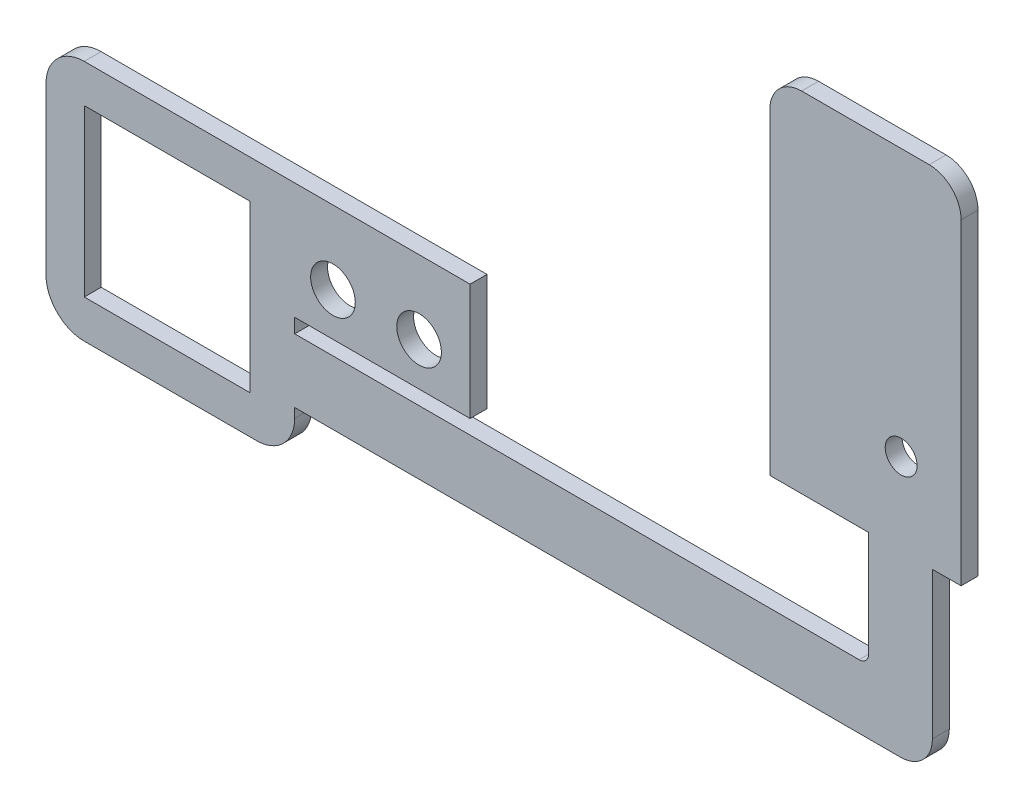
ISO-10303-21;
HEADER;
FILE_DESCRIPTION(('STEP AP214'),'2;1');
FILE_NAME('part.step','',(''),(''),'','','');
FILE_SCHEMA(('AUTOMOTIVE_DESIGN { 1 0 10303 214 1 1 1 1 }'));
ENDSEC;
DATA;
#1=APPLICATION_CONTEXT('core data for automotive mechanical design processes');
#2=APPLICATION_PROTOCOL_DEFINITION('international standard','automotive_design',2000,#1);
#3=PRODUCT_CONTEXT('',#1,'mechanical');
#4=PRODUCT('Part','Part','',(#3));
#5=PRODUCT_RELATED_PRODUCT_CATEGORY('part','',(#4));
#6=PRODUCT_DEFINITION_FORMATION('','',#4);
#7=PRODUCT_DEFINITION_CONTEXT('part definition',#1,'design');
#8=PRODUCT_DEFINITION('design','',#6,#7);
#9=PRODUCT_DEFINITION_SHAPE('','',#8);
#10=(LENGTH_UNIT() NAMED_UNIT(*) SI_UNIT(.MILLI.,.METRE.));
#11=(NAMED_UNIT(*) PLANE_ANGLE_UNIT() SI_UNIT($,.RADIAN.));
#12=(NAMED_UNIT(*) SI_UNIT($,.STERADIAN.) SOLID_ANGLE_UNIT());
#13=UNCERTAINTY_MEASURE_WITH_UNIT(LENGTH_MEASURE(1.E-05),#10,'distance_accuracy_value','');
#14=(GEOMETRIC_REPRESENTATION_CONTEXT(3) GLOBAL_UNCERTAINTY_ASSIGNED_CONTEXT((#13)) GLOBAL_UNIT_ASSIGNED_CONTEXT((#10,
#11,#12)) REPRESENTATION_CONTEXT('',''));
#15=CARTESIAN_POINT('',(0.,0.,0.));
#16=DIRECTION('',(0.,0.,1.));
#17=DIRECTION('',(1.,0.,0.));
#18=AXIS2_PLACEMENT_3D('',#15,#16,#17);
#19=CARTESIAN_POINT('',(123.02,-64.125,0.));
#20=DIRECTION('',(0.,0.,-1.));
#21=DIRECTION('',(1.,0.,0.));
#22=AXIS2_PLACEMENT_3D('',#19,#20,#21);
#23=CYLINDRICAL_SURFACE('',#22,0.5);
#24=DIRECTION('',(0.,0.,1.));
#25=VECTOR('',#24,1.);
#26=CARTESIAN_POINT('',(123.52,-64.125,0.));
#27=LINE('',#26,#25);
#28=CARTESIAN_POINT('',(123.52,-64.125,0.));
#29=VERTEX_POINT('',#28);
#30=CARTESIAN_POINT('',(123.52,-64.125,0.53));
#31=VERTEX_POINT('',#30);
#32=EDGE_CURVE('E10',#29,#31,#27,.T.);
#33=ORIENTED_EDGE('',*,*,#32,.T.);
#34=CARTESIAN_POINT('',(123.02,-64.125,0.53));
#35=DIRECTION('',(0.,0.,1.));
#36=DIRECTION('',(1.,0.,0.));
#37=AXIS2_PLACEMENT_3D('',#34,#35,#36);
#38=CIRCLE('',#37,0.5);
#39=EDGE_CURVE('E411',#31,#31,#38,.T.);
#40=ORIENTED_EDGE('',*,*,#39,.T.);
#41=ORIENTED_EDGE('',*,*,#32,.F.);
#42=CARTESIAN_POINT('',(123.02,-64.125,0.));
#43=DIRECTION('',(0.,0.,1.));
#44=DIRECTION('',(1.,0.,0.));
#45=AXIS2_PLACEMENT_3D('',#42,#43,#44);
#46=CIRCLE('',#45,0.5);
#47=EDGE_CURVE('E323',#29,#29,#46,.T.);
#48=ORIENTED_EDGE('',*,*,#47,.F.);
#49=EDGE_LOOP('',(#33,#40,#41,#48));
#50=FACE_BOUND('',#49,.T.);
#51=ADVANCED_FACE('F15',(#50),#23,.F.);
#52=CARTESIAN_POINT('',(107.9,-68.5,-0.046));
#53=DIRECTION('',(0.,0.,-1.));
#54=DIRECTION('',(0.,-1.,0.));
#55=AXIS2_PLACEMENT_3D('',#52,#53,#54);
#56=CYLINDRICAL_SURFACE('',#55,0.7);
#57=CARTESIAN_POINT('',(107.9,-68.5,0.));
#58=DIRECTION('',(0.,0.,-1.));
#59=DIRECTION('',(0.,-1.,0.));
#60=AXIS2_PLACEMENT_3D('',#57,#58,#59);
#61=CIRCLE('',#60,0.7);
#62=CARTESIAN_POINT('',(107.9,-69.2,0.));
#63=VERTEX_POINT('',#62);
#64=EDGE_CURVE('E351',#63,#63,#61,.T.);
#65=ORIENTED_EDGE('',*,*,#64,.T.);
#66=DIRECTION('',(0.,0.,1.));
#67=VECTOR('',#66,1.);
#68=CARTESIAN_POINT('',(107.9,-69.2,-0.046));
#69=LINE('',#68,#67);
#70=CARTESIAN_POINT('',(107.9,-69.2,0.53));
#71=VERTEX_POINT('',#70);
#72=EDGE_CURVE('E26',#63,#71,#69,.T.);
#73=ORIENTED_EDGE('',*,*,#72,.T.);
#74=CARTESIAN_POINT('',(107.9,-68.5,0.53));
#75=DIRECTION('',(0.,0.,-1.));
#76=DIRECTION('',(0.,-1.,0.));
#77=AXIS2_PLACEMENT_3D('',#74,#75,#76);
#78=CIRCLE('',#77,0.7);
#79=EDGE_CURVE('E415',#71,#71,#78,.T.);
#80=ORIENTED_EDGE('',*,*,#79,.F.);
#81=ORIENTED_EDGE('',*,*,#72,.F.);
#82=EDGE_LOOP('',(#65,#73,#80,#81));
#83=FACE_BOUND('',#82,.T.);
#84=ADVANCED_FACE('F920',(#83),#56,.F.);
#85=CARTESIAN_POINT('',(105.2,-68.5,-0.046));
#86=DIRECTION('',(0.,0.,-1.));
#87=DIRECTION('',(0.,-1.,0.));
#88=AXIS2_PLACEMENT_3D('',#85,#86,#87);
#89=CYLINDRICAL_SURFACE('',#88,0.7);
#90=CARTESIAN_POINT('',(105.2,-68.5,0.));
#91=DIRECTION('',(0.,0.,-1.));
#92=DIRECTION('',(0.,-1.,0.));
#93=AXIS2_PLACEMENT_3D('',#90,#91,#92);
#94=CIRCLE('',#93,0.7);
#95=CARTESIAN_POINT('',(105.2,-69.2,0.));
#96=VERTEX_POINT('',#95);
#97=EDGE_CURVE('E469',#96,#96,#94,.T.);
#98=ORIENTED_EDGE('',*,*,#97,.T.);
#99=DIRECTION('',(0.,0.,1.));
#100=VECTOR('',#99,1.);
#101=CARTESIAN_POINT('',(105.2,-69.2,-0.046));
#102=LINE('',#101,#100);
#103=CARTESIAN_POINT('',(105.2,-69.2,0.53));
#104=VERTEX_POINT('',#103);
#105=EDGE_CURVE('E263',#96,#104,#102,.T.);
#106=ORIENTED_EDGE('',*,*,#105,.T.);
#107=CARTESIAN_POINT('',(105.2,-68.5,0.53));
#108=DIRECTION('',(0.,0.,-1.));
#109=DIRECTION('',(0.,-1.,0.));
#110=AXIS2_PLACEMENT_3D('',#107,#108,#109);
#111=CIRCLE('',#110,0.7);
#112=EDGE_CURVE('E274',#104,#104,#111,.T.);
#113=ORIENTED_EDGE('',*,*,#112,.F.);
#114=ORIENTED_EDGE('',*,*,#105,.F.);
#115=EDGE_LOOP('',(#98,#106,#113,#114));
#116=FACE_BOUND('',#115,.T.);
#117=ADVANCED_FACE('F880',(#116),#89,.F.);
#118=CARTESIAN_POINT('',(102.6,-67.4,0.));
#119=DIRECTION('',(0.,-1.,0.));
#120=DIRECTION('',(0.,0.,-1.));
#121=AXIS2_PLACEMENT_3D('',#118,#119,#120);
#122=PLANE('',#121);
#123=DIRECTION('',(0.,0.,1.));
#124=VECTOR('',#123,1.);
#125=CARTESIAN_POINT('',(102.6,-67.4,0.));
#126=LINE('',#125,#124);
#127=CARTESIAN_POINT('',(102.6,-67.4,0.));
#128=VERTEX_POINT('',#127);
#129=CARTESIAN_POINT('',(102.6,-67.4,0.53));
#130=VERTEX_POINT('',#129);
#131=EDGE_CURVE('E251',#128,#130,#126,.T.);
#132=ORIENTED_EDGE('',*,*,#131,.T.);
#133=DIRECTION('',(-1.,0.,0.));
#134=VECTOR('',#133,1.);
#135=CARTESIAN_POINT('',(102.6,-67.4,0.53));
#136=LINE('',#135,#134);
#137=CARTESIAN_POINT('',(97.4,-67.4,0.53));
#138=VERTEX_POINT('',#137);
#139=EDGE_CURVE('E255',#130,#138,#136,.T.);
#140=ORIENTED_EDGE('',*,*,#139,.T.);
#141=DIRECTION('',(0.,0.,1.));
#142=VECTOR('',#141,1.);
#143=CARTESIAN_POINT('',(97.4,-67.4,0.));
#144=LINE('',#143,#142);
#145=CARTESIAN_POINT('',(97.4,-67.4,0.));
#146=VERTEX_POINT('',#145);
#147=EDGE_CURVE('E264',#146,#138,#144,.T.);
#148=ORIENTED_EDGE('',*,*,#147,.F.);
#149=DIRECTION('',(-1.,0.,0.));
#150=VECTOR('',#149,1.);
#151=CARTESIAN_POINT('',(102.6,-67.4,0.));
#152=LINE('',#151,#150);
#153=EDGE_CURVE('E258',#128,#146,#152,.T.);
#154=ORIENTED_EDGE('',*,*,#153,.F.);
#155=EDGE_LOOP('',(#132,#140,#148,#154));
#156=FACE_BOUND('',#155,.T.);
#157=ADVANCED_FACE('F253',(#156),#122,.T.);
#158=CARTESIAN_POINT('',(102.6,-72.6,0.));
#159=DIRECTION('',(-1.,0.,0.));
#160=DIRECTION('',(0.,0.,1.));
#161=AXIS2_PLACEMENT_3D('',#158,#159,#160);
#162=PLANE('',#161);
#163=DIRECTION('',(0.,0.,1.));
#164=VECTOR('',#163,1.);
#165=CARTESIAN_POINT('',(102.6,-72.6,0.));
#166=LINE('',#165,#164);
#167=CARTESIAN_POINT('',(102.6,-72.6,0.));
#168=VERTEX_POINT('',#167);
#169=CARTESIAN_POINT('',(102.6,-72.6,0.53));
#170=VERTEX_POINT('',#169);
#171=EDGE_CURVE('E269',#168,#170,#166,.T.);
#172=ORIENTED_EDGE('',*,*,#171,.T.);
#173=DIRECTION('',(0.,1.,0.));
#174=VECTOR('',#173,1.);
#175=CARTESIAN_POINT('',(102.6,-72.6,0.53));
#176=LINE('',#175,#174);
#177=EDGE_CURVE('E267',#170,#130,#176,.T.);
#178=ORIENTED_EDGE('',*,*,#177,.T.);
#179=ORIENTED_EDGE('',*,*,#131,.F.);
#180=DIRECTION('',(0.,1.,0.));
#181=VECTOR('',#180,1.);
#182=CARTESIAN_POINT('',(102.6,-72.6,0.));
#183=LINE('',#182,#181);
#184=EDGE_CURVE('E431',#168,#128,#183,.T.);
#185=ORIENTED_EDGE('',*,*,#184,.F.);
#186=EDGE_LOOP('',(#172,#178,#179,#185));
#187=FACE_BOUND('',#186,.T.);
#188=ADVANCED_FACE('F268',(#187),#162,.T.);
#189=CARTESIAN_POINT('',(97.4,-67.4,0.));
#190=DIRECTION('',(1.,0.,0.));
#191=DIRECTION('',(0.,1.,0.));
#192=AXIS2_PLACEMENT_3D('',#189,#190,#191);
#193=PLANE('',#192);
#194=ORIENTED_EDGE('',*,*,#147,.T.);
#195=DIRECTION('',(0.,-1.,0.));
#196=VECTOR('',#195,1.);
#197=CARTESIAN_POINT('',(97.4,-67.4,0.53));
#198=LINE('',#197,#196);
#199=CARTESIAN_POINT('',(97.4,-72.6,0.53));
#200=VERTEX_POINT('',#199);
#201=EDGE_CURVE('E279',#138,#200,#198,.T.);
#202=ORIENTED_EDGE('',*,*,#201,.T.);
#203=DIRECTION('',(0.,0.,1.));
#204=VECTOR('',#203,1.);
#205=CARTESIAN_POINT('',(97.4,-72.6,0.));
#206=LINE('',#205,#204);
#207=CARTESIAN_POINT('',(97.4,-72.6,0.));
#208=VERTEX_POINT('',#207);
#209=EDGE_CURVE('E312',#208,#200,#206,.T.);
#210=ORIENTED_EDGE('',*,*,#209,.F.);
#211=DIRECTION('',(0.,-1.,0.));
#212=VECTOR('',#211,1.);
#213=CARTESIAN_POINT('',(97.4,-67.4,0.));
#214=LINE('',#213,#212);
#215=EDGE_CURVE('E389',#146,#208,#214,.T.);
#216=ORIENTED_EDGE('',*,*,#215,.F.);
#217=EDGE_LOOP('',(#194,#202,#210,#216));
#218=FACE_BOUND('',#217,.T.);
#219=ADVANCED_FACE('F614',(#218),#193,.T.);
#220=CARTESIAN_POINT('',(97.4,-72.6,0.));
#221=DIRECTION('',(0.,1.,0.));
#222=DIRECTION('',(1.,0.,0.));
#223=AXIS2_PLACEMENT_3D('',#220,#221,#222);
#224=PLANE('',#223);
#225=ORIENTED_EDGE('',*,*,#209,.T.);
#226=DIRECTION('',(1.,0.,0.));
#227=VECTOR('',#226,1.);
#228=CARTESIAN_POINT('',(97.4,-72.6,0.53));
#229=LINE('',#228,#227);
#230=EDGE_CURVE('E286',#200,#170,#229,.T.);
#231=ORIENTED_EDGE('',*,*,#230,.T.);
#232=ORIENTED_EDGE('',*,*,#171,.F.);
#233=DIRECTION('',(1.,0.,0.));
#234=VECTOR('',#233,1.);
#235=CARTESIAN_POINT('',(97.4,-72.6,0.));
#236=LINE('',#235,#234);
#237=EDGE_CURVE('E393',#208,#168,#236,.T.);
#238=ORIENTED_EDGE('',*,*,#237,.F.);
#239=EDGE_LOOP('',(#225,#231,#232,#238));
#240=FACE_BOUND('',#239,.T.);
#241=ADVANCED_FACE('F611',(#240),#224,.T.);
#242=CARTESIAN_POINT('',(97.400000469195,-67.40000046919,0.));
#243=DIRECTION('',(0.,0.,-1.));
#244=DIRECTION('',(-0.999999999999924,3.9099537344877E-07,0.));
#245=AXIS2_PLACEMENT_3D('',#242,#243,#244);
#246=CYLINDRICAL_SURFACE('',#245,1.200000469195);
#247=DIRECTION('',(0.,0.,1.));
#248=VECTOR('',#247,1.);
#249=CARTESIAN_POINT('',(96.2,-67.4,0.));
#250=LINE('',#249,#248);
#251=CARTESIAN_POINT('',(96.2,-67.4,0.));
#252=VERTEX_POINT('',#251);
#253=CARTESIAN_POINT('',(96.2,-67.4,0.53));
#254=VERTEX_POINT('',#253);
#255=EDGE_CURVE('E396',#252,#254,#250,.T.);
#256=ORIENTED_EDGE('',*,*,#255,.T.);
#257=CARTESIAN_POINT('',(97.400000469195,-67.40000046919,0.53));
#258=DIRECTION('',(0.,0.,-1.));
#259=DIRECTION('',(-0.999999999999924,3.9099537344877E-07,0.));
#260=AXIS2_PLACEMENT_3D('',#257,#258,#259);
#261=CIRCLE('',#260,1.200000469195);
#262=CARTESIAN_POINT('',(97.4,-66.2,0.53));
#263=VERTEX_POINT('',#262);
#264=EDGE_CURVE('E368',#254,#263,#261,.T.);
#265=ORIENTED_EDGE('',*,*,#264,.T.);
#266=DIRECTION('',(0.,0.,1.));
#267=VECTOR('',#266,1.);
#268=CARTESIAN_POINT('',(97.4,-66.2,0.));
#269=LINE('',#268,#267);
#270=CARTESIAN_POINT('',(97.4,-66.2,0.));
#271=VERTEX_POINT('',#270);
#272=EDGE_CURVE('E394',#271,#263,#269,.T.);
#273=ORIENTED_EDGE('',*,*,#272,.F.);
#274=CARTESIAN_POINT('',(97.400000469195,-67.40000046919,0.));
#275=DIRECTION('',(0.,0.,-1.));
#276=DIRECTION('',(-0.999999999999924,3.9099537344877E-07,0.));
#277=AXIS2_PLACEMENT_3D('',#274,#275,#276);
#278=CIRCLE('',#277,1.200000469195);
#279=EDGE_CURVE('E298',#252,#271,#278,.T.);
#280=ORIENTED_EDGE('',*,*,#279,.F.);
#281=EDGE_LOOP('',(#256,#265,#273,#280));
#282=FACE_BOUND('',#281,.T.);
#283=ADVANCED_FACE('F994',(#282),#246,.T.);
#284=CARTESIAN_POINT('',(97.4,-66.2,0.));
#285=DIRECTION('',(0.,1.,0.));
#286=DIRECTION('',(1.,0.,0.));
#287=AXIS2_PLACEMENT_3D('',#284,#285,#286);
#288=PLANE('',#287);
#289=ORIENTED_EDGE('',*,*,#272,.T.);
#290=DIRECTION('',(1.,0.,0.));
#291=VECTOR('',#290,1.);
#292=CARTESIAN_POINT('',(97.4,-66.2,0.53));
#293=LINE('',#292,#291);
#294=CARTESIAN_POINT('',(109.5,-66.2,0.53));
#295=VERTEX_POINT('',#294);
#296=EDGE_CURVE('E364',#263,#295,#293,.T.);
#297=ORIENTED_EDGE('',*,*,#296,.T.);
#298=DIRECTION('',(0.,0.,1.));
#299=VECTOR('',#298,1.);
#300=CARTESIAN_POINT('',(109.5,-66.2,0.));
#301=LINE('',#300,#299);
#302=CARTESIAN_POINT('',(109.5,-66.2,0.));
#303=VERTEX_POINT('',#302);
#304=EDGE_CURVE('E454',#303,#295,#301,.T.);
#305=ORIENTED_EDGE('',*,*,#304,.F.);
#306=DIRECTION('',(1.,0.,0.));
#307=VECTOR('',#306,1.);
#308=CARTESIAN_POINT('',(97.4,-66.2,0.));
#309=LINE('',#308,#307);
#310=EDGE_CURVE('E302',#271,#303,#309,.T.);
#311=ORIENTED_EDGE('',*,*,#310,.F.);
#312=EDGE_LOOP('',(#289,#297,#305,#311));
#313=FACE_BOUND('',#312,.T.);
#314=ADVANCED_FACE('F1006',(#313),#288,.T.);
#315=CARTESIAN_POINT('',(96.2,-72.6,0.));
#316=DIRECTION('',(-1.,0.,0.));
#317=DIRECTION('',(0.,0.,1.));
#318=AXIS2_PLACEMENT_3D('',#315,#316,#317);
#319=PLANE('',#318);
#320=DIRECTION('',(0.,0.,1.));
#321=VECTOR('',#320,1.);
#322=CARTESIAN_POINT('',(96.2,-72.6,0.));
#323=LINE('',#322,#321);
#324=CARTESIAN_POINT('',(96.2,-72.6,0.));
#325=VERTEX_POINT('',#324);
#326=CARTESIAN_POINT('',(96.2,-72.6,0.53));
#327=VERTEX_POINT('',#326);
#328=EDGE_CURVE('E474',#325,#327,#323,.T.);
#329=ORIENTED_EDGE('',*,*,#328,.T.);
#330=DIRECTION('',(0.,1.,0.));
#331=VECTOR('',#330,1.);
#332=CARTESIAN_POINT('',(96.2,-72.6,0.53));
#333=LINE('',#332,#331);
#334=EDGE_CURVE('E358',#327,#254,#333,.T.);
#335=ORIENTED_EDGE('',*,*,#334,.T.);
#336=ORIENTED_EDGE('',*,*,#255,.F.);
#337=DIRECTION('',(0.,1.,0.));
#338=VECTOR('',#337,1.);
#339=CARTESIAN_POINT('',(96.2,-72.6,0.));
#340=LINE('',#339,#338);
#341=EDGE_CURVE('E303',#325,#252,#340,.T.);
#342=ORIENTED_EDGE('',*,*,#341,.F.);
#343=EDGE_LOOP('',(#329,#335,#336,#342));
#344=FACE_BOUND('',#343,.T.);
#345=ADVANCED_FACE('F939',(#344),#319,.T.);
#346=CARTESIAN_POINT('',(109.5,-66.2,0.));
#347=DIRECTION('',(1.,0.,0.));
#348=DIRECTION('',(0.,1.,0.));
#349=AXIS2_PLACEMENT_3D('',#346,#347,#348);
#350=PLANE('',#349);
#351=ORIENTED_EDGE('',*,*,#304,.T.);
#352=DIRECTION('',(0.,-1.,0.));
#353=VECTOR('',#352,1.);
#354=CARTESIAN_POINT('',(109.5,-66.2,0.53));
#355=LINE('',#354,#353);
#356=CARTESIAN_POINT('',(109.5,-69.85,0.53));
#357=VERTEX_POINT('',#356);
#358=EDGE_CURVE('E369',#295,#357,#355,.T.);
#359=ORIENTED_EDGE('',*,*,#358,.T.);
#360=DIRECTION('',(0.,0.,1.));
#361=VECTOR('',#360,1.);
#362=CARTESIAN_POINT('',(109.5,-69.85,0.));
#363=LINE('',#362,#361);
#364=CARTESIAN_POINT('',(109.5,-69.85,0.));
#365=VERTEX_POINT('',#364);
#366=EDGE_CURVE('E465',#365,#357,#363,.T.);
#367=ORIENTED_EDGE('',*,*,#366,.F.);
#368=DIRECTION('',(0.,-1.,0.));
#369=VECTOR('',#368,1.);
#370=CARTESIAN_POINT('',(109.5,-66.2,0.));
#371=LINE('',#370,#369);
#372=EDGE_CURVE('E297',#303,#365,#371,.T.);
#373=ORIENTED_EDGE('',*,*,#372,.F.);
#374=EDGE_LOOP('',(#351,#359,#367,#373));
#375=FACE_BOUND('',#374,.T.);
#376=ADVANCED_FACE('F933',(#375),#350,.T.);
#377=CARTESIAN_POINT('',(97.400000469195,-72.5999995308,0.));
#378=DIRECTION('',(0.,0.,-1.));
#379=DIRECTION('',(-3.9099537344877E-07,-0.999999999999924,0.));
#380=AXIS2_PLACEMENT_3D('',#377,#378,#379);
#381=CYLINDRICAL_SURFACE('',#380,1.200000469195);
#382=DIRECTION('',(0.,0.,1.));
#383=VECTOR('',#382,1.);
#384=CARTESIAN_POINT('',(97.4,-73.8,0.));
#385=LINE('',#384,#383);
#386=CARTESIAN_POINT('',(97.4,-73.8,0.));
#387=VERTEX_POINT('',#386);
#388=CARTESIAN_POINT('',(97.4,-73.8,0.53));
#389=VERTEX_POINT('',#388);
#390=EDGE_CURVE('E462',#387,#389,#385,.T.);
#391=ORIENTED_EDGE('',*,*,#390,.T.);
#392=CARTESIAN_POINT('',(97.400000469195,-72.5999995308,0.53));
#393=DIRECTION('',(0.,0.,-1.));
#394=DIRECTION('',(-3.9099537344877E-07,-0.999999999999924,0.));
#395=AXIS2_PLACEMENT_3D('',#392,#393,#394);
#396=CIRCLE('',#395,1.200000469195);
#397=EDGE_CURVE('E353',#389,#327,#396,.T.);
#398=ORIENTED_EDGE('',*,*,#397,.T.);
#399=ORIENTED_EDGE('',*,*,#328,.F.);
#400=CARTESIAN_POINT('',(97.400000469195,-72.5999995308,0.));
#401=DIRECTION('',(0.,0.,-1.));
#402=DIRECTION('',(-3.9099537344877E-07,-0.999999999999924,0.));
#403=AXIS2_PLACEMENT_3D('',#400,#401,#402);
#404=CIRCLE('',#403,1.200000469195);
#405=EDGE_CURVE('E603',#387,#325,#404,.T.);
#406=ORIENTED_EDGE('',*,*,#405,.F.);
#407=EDGE_LOOP('',(#391,#398,#399,#406));
#408=FACE_BOUND('',#407,.T.);
#409=ADVANCED_FACE('F938',(#408),#381,.T.);
#410=CARTESIAN_POINT('',(109.5,-69.85,0.));
#411=DIRECTION('',(0.,-1.,0.));
#412=DIRECTION('',(0.,0.,-1.));
#413=AXIS2_PLACEMENT_3D('',#410,#411,#412);
#414=PLANE('',#413);
#415=ORIENTED_EDGE('',*,*,#366,.T.);
#416=DIRECTION('',(-1.,0.,0.));
#417=VECTOR('',#416,1.);
#418=CARTESIAN_POINT('',(109.5,-69.85,0.53));
#419=LINE('',#418,#417);
#420=CARTESIAN_POINT('',(104.,-69.85,0.53));
#421=VERTEX_POINT('',#420);
#422=EDGE_CURVE('E407',#357,#421,#419,.T.);
#423=ORIENTED_EDGE('',*,*,#422,.T.);
#424=DIRECTION('',(0.,0.,1.));
#425=VECTOR('',#424,1.);
#426=CARTESIAN_POINT('',(104.,-69.85,0.));
#427=LINE('',#426,#425);
#428=CARTESIAN_POINT('',(104.,-69.85,0.));
#429=VERTEX_POINT('',#428);
#430=EDGE_CURVE('E451',#429,#421,#427,.T.);
#431=ORIENTED_EDGE('',*,*,#430,.F.);
#432=DIRECTION('',(-1.,0.,0.));
#433=VECTOR('',#432,1.);
#434=CARTESIAN_POINT('',(109.5,-69.85,0.));
#435=LINE('',#434,#433);
#436=EDGE_CURVE('E292',#365,#429,#435,.T.);
#437=ORIENTED_EDGE('',*,*,#436,.F.);
#438=EDGE_LOOP('',(#415,#423,#431,#437));
#439=FACE_BOUND('',#438,.T.);
#440=ADVANCED_FACE('F17',(#439),#414,.T.);
#441=CARTESIAN_POINT('',(102.8,-73.8,0.));
#442=DIRECTION('',(0.,-1.,0.));
#443=DIRECTION('',(0.,0.,-1.));
#444=AXIS2_PLACEMENT_3D('',#441,#442,#443);
#445=PLANE('',#444);
#446=DIRECTION('',(0.,0.,1.));
#447=VECTOR('',#446,1.);
#448=CARTESIAN_POINT('',(102.8,-73.8,0.));
#449=LINE('',#448,#447);
#450=CARTESIAN_POINT('',(102.8,-73.8,0.));
#451=VERTEX_POINT('',#450);
#452=CARTESIAN_POINT('',(102.8,-73.8,0.53));
#453=VERTEX_POINT('',#452);
#454=EDGE_CURVE('E448',#451,#453,#449,.T.);
#455=ORIENTED_EDGE('',*,*,#454,.T.);
#456=DIRECTION('',(-1.,0.,0.));
#457=VECTOR('',#456,1.);
#458=CARTESIAN_POINT('',(102.8,-73.8,0.53));
#459=LINE('',#458,#457);
#460=EDGE_CURVE('E357',#453,#389,#459,.T.);
#461=ORIENTED_EDGE('',*,*,#460,.T.);
#462=ORIENTED_EDGE('',*,*,#390,.F.);
#463=DIRECTION('',(-1.,0.,0.));
#464=VECTOR('',#463,1.);
#465=CARTESIAN_POINT('',(102.8,-73.8,0.));
#466=LINE('',#465,#464);
#467=EDGE_CURVE('E401',#451,#387,#466,.T.);
#468=ORIENTED_EDGE('',*,*,#467,.F.);
#469=EDGE_LOOP('',(#455,#461,#462,#468));
#470=FACE_BOUND('',#469,.T.);
#471=ADVANCED_FACE('F891',(#470),#445,.T.);
#472=CARTESIAN_POINT('',(104.,-69.85,0.));
#473=DIRECTION('',(1.,0.,0.));
#474=DIRECTION('',(0.,1.,0.));
#475=AXIS2_PLACEMENT_3D('',#472,#473,#474);
#476=PLANE('',#475);
#477=ORIENTED_EDGE('',*,*,#430,.T.);
#478=DIRECTION('',(0.,-1.,0.));
#479=VECTOR('',#478,1.);
#480=CARTESIAN_POINT('',(104.,-69.85,0.53));
#481=LINE('',#480,#479);
#482=CARTESIAN_POINT('',(104.,-70.3,0.53));
#483=VERTEX_POINT('',#482);
#484=EDGE_CURVE('E317',#421,#483,#481,.T.);
#485=ORIENTED_EDGE('',*,*,#484,.T.);
#486=DIRECTION('',(0.,0.,1.));
#487=VECTOR('',#486,1.);
#488=CARTESIAN_POINT('',(104.,-70.3,0.));
#489=LINE('',#488,#487);
#490=CARTESIAN_POINT('',(104.,-70.3,0.));
#491=VERTEX_POINT('',#490);
#492=EDGE_CURVE('E379',#491,#483,#489,.T.);
#493=ORIENTED_EDGE('',*,*,#492,.F.);
#494=DIRECTION('',(0.,-1.,0.));
#495=VECTOR('',#494,1.);
#496=CARTESIAN_POINT('',(104.,-69.85,0.));
#497=LINE('',#496,#495);
#498=EDGE_CURVE('E296',#429,#491,#497,.T.);
#499=ORIENTED_EDGE('',*,*,#498,.F.);
#500=EDGE_LOOP('',(#477,#485,#493,#499));
#501=FACE_BOUND('',#500,.T.);
#502=ADVANCED_FACE('F885',(#501),#476,.T.);
#503=CARTESIAN_POINT('',(102.7999995308,-72.5999995308,0.));
#504=DIRECTION('',(0.,0.,-1.));
#505=DIRECTION('',(0.999999999999924,-3.9099536160647E-07,0.));
#506=AXIS2_PLACEMENT_3D('',#503,#504,#505);
#507=CYLINDRICAL_SURFACE('',#506,1.200000469195);
#508=DIRECTION('',(0.,0.,1.));
#509=VECTOR('',#508,1.);
#510=CARTESIAN_POINT('',(104.,-72.6,0.));
#511=LINE('',#510,#509);
#512=CARTESIAN_POINT('',(104.,-72.6,0.));
#513=VERTEX_POINT('',#512);
#514=CARTESIAN_POINT('',(104.,-72.6,0.53));
#515=VERTEX_POINT('',#514);
#516=EDGE_CURVE('E376',#513,#515,#511,.T.);
#517=ORIENTED_EDGE('',*,*,#516,.T.);
#518=CARTESIAN_POINT('',(102.7999995308,-72.5999995308,0.53));
#519=DIRECTION('',(0.,0.,-1.));
#520=DIRECTION('',(0.999999999999924,-3.9099536160647E-07,0.));
#521=AXIS2_PLACEMENT_3D('',#518,#519,#520);
#522=CIRCLE('',#521,1.200000469195);
#523=EDGE_CURVE('E342',#515,#453,#522,.T.);
#524=ORIENTED_EDGE('',*,*,#523,.T.);
#525=ORIENTED_EDGE('',*,*,#454,.F.);
#526=CARTESIAN_POINT('',(102.7999995308,-72.5999995308,0.));
#527=DIRECTION('',(0.,0.,-1.));
#528=DIRECTION('',(0.999999999999924,-3.9099536160647E-07,0.));
#529=AXIS2_PLACEMENT_3D('',#526,#527,#528);
#530=CIRCLE('',#529,1.200000469195);
#531=EDGE_CURVE('E374',#513,#451,#530,.T.);
#532=ORIENTED_EDGE('',*,*,#531,.F.);
#533=EDGE_LOOP('',(#517,#524,#525,#532));
#534=FACE_BOUND('',#533,.T.);
#535=ADVANCED_FACE('F890',(#534),#507,.T.);
#536=CARTESIAN_POINT('',(104.,-70.3,0.));
#537=DIRECTION('',(0.,1.,0.));
#538=DIRECTION('',(1.,0.,0.));
#539=AXIS2_PLACEMENT_3D('',#536,#537,#538);
#540=PLANE('',#539);
#541=ORIENTED_EDGE('',*,*,#492,.T.);
#542=DIRECTION('',(1.,0.,0.));
#543=VECTOR('',#542,1.);
#544=CARTESIAN_POINT('',(104.,-70.3,0.53));
#545=LINE('',#544,#543);
#546=CARTESIAN_POINT('',(121.7,-70.3,0.53));
#547=VERTEX_POINT('',#546);
#548=EDGE_CURVE('E313',#483,#547,#545,.T.);
#549=ORIENTED_EDGE('',*,*,#548,.T.);
#550=DIRECTION('',(0.,0.,1.));
#551=VECTOR('',#550,1.);
#552=CARTESIAN_POINT('',(121.7,-70.3,0.));
#553=LINE('',#552,#551);
#554=CARTESIAN_POINT('',(121.7,-70.3,0.));
#555=VERTEX_POINT('',#554);
#556=EDGE_CURVE('E380',#555,#547,#553,.T.);
#557=ORIENTED_EDGE('',*,*,#556,.F.);
#558=DIRECTION('',(1.,0.,0.));
#559=VECTOR('',#558,1.);
#560=CARTESIAN_POINT('',(104.,-70.3,0.));
#561=LINE('',#560,#559);
#562=EDGE_CURVE('E348',#491,#555,#561,.T.);
#563=ORIENTED_EDGE('',*,*,#562,.F.);
#564=EDGE_LOOP('',(#541,#549,#557,#563));
#565=FACE_BOUND('',#564,.T.);
#566=ADVANCED_FACE('F901',(#565),#540,.T.);
#567=CARTESIAN_POINT('',(104.,-72.3,0.));
#568=DIRECTION('',(1.,0.,0.));
#569=DIRECTION('',(0.,1.,0.));
#570=AXIS2_PLACEMENT_3D('',#567,#568,#569);
#571=PLANE('',#570);
#572=DIRECTION('',(0.,0.,1.));
#573=VECTOR('',#572,1.);
#574=CARTESIAN_POINT('',(104.,-72.3,0.));
#575=LINE('',#574,#573);
#576=CARTESIAN_POINT('',(104.,-72.3,0.));
#577=VERTEX_POINT('',#576);
#578=CARTESIAN_POINT('',(104.,-72.3,0.53));
#579=VERTEX_POINT('',#578);
#580=EDGE_CURVE('E441',#577,#579,#575,.T.);
#581=ORIENTED_EDGE('',*,*,#580,.T.);
#582=DIRECTION('',(0.,-1.,0.));
#583=VECTOR('',#582,1.);
#584=CARTESIAN_POINT('',(104.,-72.3,0.53));
#585=LINE('',#584,#583);
#586=EDGE_CURVE('E337',#579,#515,#585,.T.);
#587=ORIENTED_EDGE('',*,*,#586,.T.);
#588=ORIENTED_EDGE('',*,*,#516,.F.);
#589=DIRECTION('',(0.,-1.,0.));
#590=VECTOR('',#589,1.);
#591=CARTESIAN_POINT('',(104.,-72.3,0.));
#592=LINE('',#591,#590);
#593=EDGE_CURVE('E370',#577,#513,#592,.T.);
#594=ORIENTED_EDGE('',*,*,#593,.F.);
#595=EDGE_LOOP('',(#581,#587,#588,#594));
#596=FACE_BOUND('',#595,.T.);
#597=ADVANCED_FACE('F910',(#596),#571,.T.);
#598=CARTESIAN_POINT('',(121.6999998827,-69.9999998827,0.));
#599=DIRECTION('',(0.,0.,-1.));
#600=DIRECTION('',(3.9099536160647E-07,-0.999999999999924,0.));
#601=AXIS2_PLACEMENT_3D('',#598,#599,#600);
#602=CYLINDRICAL_SURFACE('',#601,0.300000117299);
#603=ORIENTED_EDGE('',*,*,#556,.T.);
#604=CARTESIAN_POINT('',(121.6999998827,-69.9999998827,0.53));
#605=DIRECTION('',(0.,0.,1.));
#606=DIRECTION('',(3.9099536160647E-07,-0.999999999999924,0.));
#607=AXIS2_PLACEMENT_3D('',#604,#605,#606);
#608=CIRCLE('',#607,0.300000117299);
#609=CARTESIAN_POINT('',(122.,-70.,0.53));
#610=VERTEX_POINT('',#609);
#611=EDGE_CURVE('E318',#547,#610,#608,.T.);
#612=ORIENTED_EDGE('',*,*,#611,.T.);
#613=DIRECTION('',(0.,0.,1.));
#614=VECTOR('',#613,1.);
#615=CARTESIAN_POINT('',(122.,-70.,0.));
#616=LINE('',#615,#614);
#617=CARTESIAN_POINT('',(122.,-70.,0.));
#618=VERTEX_POINT('',#617);
#619=EDGE_CURVE('E485',#618,#610,#616,.T.);
#620=ORIENTED_EDGE('',*,*,#619,.F.);
#621=CARTESIAN_POINT('',(121.6999998827,-69.9999998827,0.));
#622=DIRECTION('',(0.,0.,1.));
#623=DIRECTION('',(3.9099536160647E-07,-0.999999999999924,0.));
#624=AXIS2_PLACEMENT_3D('',#621,#622,#623);
#625=CIRCLE('',#624,0.300000117299);
#626=EDGE_CURVE('E429',#555,#618,#625,.T.);
#627=ORIENTED_EDGE('',*,*,#626,.F.);
#628=EDGE_LOOP('',(#603,#612,#620,#627));
#629=FACE_BOUND('',#628,.T.);
#630=ADVANCED_FACE('F954',(#629),#602,.F.);
#631=CARTESIAN_POINT('',(123.,-72.3,0.));
#632=DIRECTION('',(0.,-1.,0.));
#633=DIRECTION('',(0.,0.,-1.));
#634=AXIS2_PLACEMENT_3D('',#631,#632,#633);
#635=PLANE('',#634);
#636=DIRECTION('',(0.,0.,1.));
#637=VECTOR('',#636,1.);
#638=CARTESIAN_POINT('',(123.,-72.3,0.));
#639=LINE('',#638,#637);
#640=CARTESIAN_POINT('',(123.,-72.3,0.));
#641=VERTEX_POINT('',#640);
#642=CARTESIAN_POINT('',(123.,-72.3,0.53));
#643=VERTEX_POINT('',#642);
#644=EDGE_CURVE('E544',#641,#643,#639,.T.);
#645=ORIENTED_EDGE('',*,*,#644,.T.);
#646=DIRECTION('',(-1.,0.,0.));
#647=VECTOR('',#646,1.);
#648=CARTESIAN_POINT('',(123.,-72.3,0.53));
#649=LINE('',#648,#647);
#650=EDGE_CURVE('E341',#643,#579,#649,.T.);
#651=ORIENTED_EDGE('',*,*,#650,.T.);
#652=ORIENTED_EDGE('',*,*,#580,.F.);
#653=DIRECTION('',(-1.,0.,0.));
#654=VECTOR('',#653,1.);
#655=CARTESIAN_POINT('',(123.,-72.3,0.));
#656=LINE('',#655,#654);
#657=EDGE_CURVE('E375',#641,#577,#656,.T.);
#658=ORIENTED_EDGE('',*,*,#657,.F.);
#659=EDGE_LOOP('',(#645,#651,#652,#658));
#660=FACE_BOUND('',#659,.T.);
#661=ADVANCED_FACE('F846',(#660),#635,.T.);
#662=CARTESIAN_POINT('',(122.,-70.,0.));
#663=DIRECTION('',(-1.,0.,0.));
#664=DIRECTION('',(0.,0.,1.));
#665=AXIS2_PLACEMENT_3D('',#662,#663,#664);
#666=PLANE('',#665);
#667=ORIENTED_EDGE('',*,*,#619,.T.);
#668=DIRECTION('',(0.,1.,0.));
#669=VECTOR('',#668,1.);
#670=CARTESIAN_POINT('',(122.,-70.,0.53));
#671=LINE('',#670,#669);
#672=CARTESIAN_POINT('',(122.,-66.695,0.53));
#673=VERTEX_POINT('',#672);
#674=EDGE_CURVE('E330',#610,#673,#671,.T.);
#675=ORIENTED_EDGE('',*,*,#674,.T.);
#676=DIRECTION('',(0.,0.,1.));
#677=VECTOR('',#676,1.);
#678=CARTESIAN_POINT('',(122.,-66.695,0.));
#679=LINE('',#678,#677);
#680=CARTESIAN_POINT('',(122.,-66.695,0.));
#681=VERTEX_POINT('',#680);
#682=EDGE_CURVE('E423',#681,#673,#679,.T.);
#683=ORIENTED_EDGE('',*,*,#682,.F.);
#684=DIRECTION('',(0.,1.,0.));
#685=VECTOR('',#684,1.);
#686=CARTESIAN_POINT('',(122.,-70.,0.));
#687=LINE('',#686,#685);
#688=EDGE_CURVE('E425',#618,#681,#687,.T.);
#689=ORIENTED_EDGE('',*,*,#688,.F.);
#690=EDGE_LOOP('',(#667,#675,#683,#689));
#691=FACE_BOUND('',#690,.T.);
#692=ADVANCED_FACE('F840',(#691),#666,.T.);
#693=CARTESIAN_POINT('',(123.00000074707,-71.30000074707,0.));
#694=DIRECTION('',(0.,0.,-1.));
#695=DIRECTION('',(0.999999999999721,7.47075749164592E-07,0.));
#696=AXIS2_PLACEMENT_3D('',#693,#694,#695);
#697=CYLINDRICAL_SURFACE('',#696,0.999999252925);
#698=DIRECTION('',(0.,0.,1.));
#699=VECTOR('',#698,1.);
#700=CARTESIAN_POINT('',(124.,-71.3,0.));
#701=LINE('',#700,#699);
#702=CARTESIAN_POINT('',(124.,-71.3,0.));
#703=VERTEX_POINT('',#702);
#704=CARTESIAN_POINT('',(124.,-71.3,0.53));
#705=VERTEX_POINT('',#704);
#706=EDGE_CURVE('E419',#703,#705,#701,.T.);
#707=ORIENTED_EDGE('',*,*,#706,.T.);
#708=CARTESIAN_POINT('',(123.00000074707,-71.30000074707,0.53));
#709=DIRECTION('',(0.,0.,-1.));
#710=DIRECTION('',(0.999999999999721,7.47075749164592E-07,0.));
#711=AXIS2_PLACEMENT_3D('',#708,#709,#710);
#712=CIRCLE('',#711,0.999999252925);
#713=EDGE_CURVE('E502',#705,#643,#712,.T.);
#714=ORIENTED_EDGE('',*,*,#713,.T.);
#715=ORIENTED_EDGE('',*,*,#644,.F.);
#716=CARTESIAN_POINT('',(123.00000074707,-71.30000074707,0.));
#717=DIRECTION('',(0.,0.,-1.));
#718=DIRECTION('',(0.999999999999721,7.47075749164592E-07,0.));
#719=AXIS2_PLACEMENT_3D('',#716,#717,#718);
#720=CIRCLE('',#719,0.999999252925);
#721=EDGE_CURVE('E290',#703,#641,#720,.T.);
#722=ORIENTED_EDGE('',*,*,#721,.F.);
#723=EDGE_LOOP('',(#707,#714,#715,#722));
#724=FACE_BOUND('',#723,.T.);
#725=ADVANCED_FACE('F845',(#724),#697,.T.);
#726=CARTESIAN_POINT('',(122.,-66.695,0.));
#727=DIRECTION('',(0.,-1.,0.));
#728=DIRECTION('',(0.,0.,-1.));
#729=AXIS2_PLACEMENT_3D('',#726,#727,#728);
#730=PLANE('',#729);
#731=ORIENTED_EDGE('',*,*,#682,.T.);
#732=DIRECTION('',(-1.,0.,0.));
#733=VECTOR('',#732,1.);
#734=CARTESIAN_POINT('',(122.,-66.695,0.53));
#735=LINE('',#734,#733);
#736=CARTESIAN_POINT('',(118.9,-66.695,0.53));
#737=VERTEX_POINT('',#736);
#738=EDGE_CURVE('E381',#673,#737,#735,.T.);
#739=ORIENTED_EDGE('',*,*,#738,.T.);
#740=DIRECTION('',(0.,0.,1.));
#741=VECTOR('',#740,1.);
#742=CARTESIAN_POINT('',(118.9,-66.695,0.));
#743=LINE('',#742,#741);
#744=CARTESIAN_POINT('',(118.9,-66.695,0.));
#745=VERTEX_POINT('',#744);
#746=EDGE_CURVE('E424',#745,#737,#743,.T.);
#747=ORIENTED_EDGE('',*,*,#746,.F.);
#748=DIRECTION('',(-1.,0.,0.));
#749=VECTOR('',#748,1.);
#750=CARTESIAN_POINT('',(122.,-66.695,0.));
#751=LINE('',#750,#749);
#752=EDGE_CURVE('E19',#681,#745,#751,.T.);
#753=ORIENTED_EDGE('',*,*,#752,.F.);
#754=EDGE_LOOP('',(#731,#739,#747,#753));
#755=FACE_BOUND('',#754,.T.);
#756=ADVANCED_FACE('F828',(#755),#730,.T.);
#757=CARTESIAN_POINT('',(124.,-66.695,0.));
#758=DIRECTION('',(1.,0.,0.));
#759=DIRECTION('',(0.,1.,0.));
#760=AXIS2_PLACEMENT_3D('',#757,#758,#759);
#761=PLANE('',#760);
#762=DIRECTION('',(0.,0.,1.));
#763=VECTOR('',#762,1.);
#764=CARTESIAN_POINT('',(124.,-66.695,0.));
#765=LINE('',#764,#763);
#766=CARTESIAN_POINT('',(124.,-66.695,0.));
#767=VERTEX_POINT('',#766);
#768=CARTESIAN_POINT('',(124.,-66.695,0.53));
#769=VERTEX_POINT('',#768);
#770=EDGE_CURVE('E507',#767,#769,#765,.T.);
#771=ORIENTED_EDGE('',*,*,#770,.T.);
#772=DIRECTION('',(0.,-1.,0.));
#773=VECTOR('',#772,1.);
#774=CARTESIAN_POINT('',(124.,-66.695,0.53));
#775=LINE('',#774,#773);
#776=EDGE_CURVE('E506',#769,#705,#775,.T.);
#777=ORIENTED_EDGE('',*,*,#776,.T.);
#778=ORIENTED_EDGE('',*,*,#706,.F.);
#779=DIRECTION('',(0.,-1.,0.));
#780=VECTOR('',#779,1.);
#781=CARTESIAN_POINT('',(124.,-66.695,0.));
#782=LINE('',#781,#780);
#783=EDGE_CURVE('E308',#767,#703,#782,.T.);
#784=ORIENTED_EDGE('',*,*,#783,.F.);
#785=EDGE_LOOP('',(#771,#777,#778,#784));
#786=FACE_BOUND('',#785,.T.);
#787=ADVANCED_FACE('F668',(#786),#761,.T.);
#788=CARTESIAN_POINT('',(118.9,-66.695,0.));
#789=DIRECTION('',(-1.,0.,0.));
#790=DIRECTION('',(0.,0.,1.));
#791=AXIS2_PLACEMENT_3D('',#788,#789,#790);
#792=PLANE('',#791);
#793=ORIENTED_EDGE('',*,*,#746,.T.);
#794=DIRECTION('',(0.,1.,0.));
#795=VECTOR('',#794,1.);
#796=CARTESIAN_POINT('',(118.9,-66.695,0.53));
#797=LINE('',#796,#795);
#798=CARTESIAN_POINT('',(118.9,-56.755,0.53));
#799=VERTEX_POINT('',#798);
#800=EDGE_CURVE('E322',#737,#799,#797,.T.);
#801=ORIENTED_EDGE('',*,*,#800,.T.);
#802=DIRECTION('',(0.,0.,1.));
#803=VECTOR('',#802,1.);
#804=CARTESIAN_POINT('',(118.9,-56.755,0.));
#805=LINE('',#804,#803);
#806=CARTESIAN_POINT('',(118.9,-56.755,0.));
#807=VERTEX_POINT('',#806);
#808=EDGE_CURVE('E414',#807,#799,#805,.T.);
#809=ORIENTED_EDGE('',*,*,#808,.F.);
#810=DIRECTION('',(0.,1.,0.));
#811=VECTOR('',#810,1.);
#812=CARTESIAN_POINT('',(118.9,-66.695,0.));
#813=LINE('',#812,#811);
#814=EDGE_CURVE('E553',#745,#807,#813,.T.);
#815=ORIENTED_EDGE('',*,*,#814,.F.);
#816=EDGE_LOOP('',(#793,#801,#809,#815));
#817=FACE_BOUND('',#816,.T.);
#818=ADVANCED_FACE('F818',(#817),#792,.T.);
#819=CARTESIAN_POINT('',(124.9,-66.695,0.));
#820=DIRECTION('',(0.,-1.,0.));
#821=DIRECTION('',(0.,0.,-1.));
#822=AXIS2_PLACEMENT_3D('',#819,#820,#821);
#823=PLANE('',#822);
#824=DIRECTION('',(0.,0.,1.));
#825=VECTOR('',#824,1.);
#826=CARTESIAN_POINT('',(124.9,-66.695,0.));
#827=LINE('',#826,#825);
#828=CARTESIAN_POINT('',(124.9,-66.695,0.));
#829=VERTEX_POINT('',#828);
#830=CARTESIAN_POINT('',(124.9,-66.695,0.53));
#831=VERTEX_POINT('',#830);
#832=EDGE_CURVE('E388',#829,#831,#827,.T.);
#833=ORIENTED_EDGE('',*,*,#832,.T.);
#834=DIRECTION('',(-1.,0.,0.));
#835=VECTOR('',#834,1.);
#836=CARTESIAN_POINT('',(124.9,-66.695,0.53));
#837=LINE('',#836,#835);
#838=EDGE_CURVE('E480',#831,#769,#837,.T.);
#839=ORIENTED_EDGE('',*,*,#838,.T.);
#840=ORIENTED_EDGE('',*,*,#770,.F.);
#841=DIRECTION('',(-1.,0.,0.));
#842=VECTOR('',#841,1.);
#843=CARTESIAN_POINT('',(124.9,-66.695,0.));
#844=LINE('',#843,#842);
#845=EDGE_CURVE('E304',#829,#767,#844,.T.);
#846=ORIENTED_EDGE('',*,*,#845,.F.);
#847=EDGE_LOOP('',(#833,#839,#840,#846));
#848=FACE_BOUND('',#847,.T.);
#849=ADVANCED_FACE('F664',(#848),#823,.T.);
#850=CARTESIAN_POINT('',(119.89999925292,-56.75499925292,0.));
#851=DIRECTION('',(0.,0.,-1.));
#852=DIRECTION('',(-0.999999999999721,-7.47075749164592E-07,0.));
#853=AXIS2_PLACEMENT_3D('',#850,#851,#852);
#854=CYLINDRICAL_SURFACE('',#853,0.999999252925);
#855=ORIENTED_EDGE('',*,*,#808,.T.);
#856=CARTESIAN_POINT('',(119.89999925292,-56.75499925292,0.53));
#857=DIRECTION('',(0.,0.,-1.));
#858=DIRECTION('',(-0.999999999999721,-7.47075749164592E-07,0.));
#859=AXIS2_PLACEMENT_3D('',#856,#857,#858);
#860=CIRCLE('',#859,0.999999252925);
#861=CARTESIAN_POINT('',(119.9,-55.755,0.53));
#862=VERTEX_POINT('',#861);
#863=EDGE_CURVE('E319',#799,#862,#860,.T.);
#864=ORIENTED_EDGE('',*,*,#863,.T.);
#865=DIRECTION('',(0.,0.,1.));
#866=VECTOR('',#865,1.);
#867=CARTESIAN_POINT('',(119.9,-55.755,0.));
#868=LINE('',#867,#866);
#869=CARTESIAN_POINT('',(119.9,-55.755,0.));
#870=VERTEX_POINT('',#869);
#871=EDGE_CURVE('E331',#870,#862,#868,.T.);
#872=ORIENTED_EDGE('',*,*,#871,.F.);
#873=CARTESIAN_POINT('',(119.89999925292,-56.75499925292,0.));
#874=DIRECTION('',(0.,0.,-1.));
#875=DIRECTION('',(-0.999999999999721,-7.47075749164592E-07,0.));
#876=AXIS2_PLACEMENT_3D('',#873,#874,#875);
#877=CIRCLE('',#876,0.999999252925);
#878=EDGE_CURVE('E557',#807,#870,#877,.T.);
#879=ORIENTED_EDGE('',*,*,#878,.F.);
#880=EDGE_LOOP('',(#855,#864,#872,#879));
#881=FACE_BOUND('',#880,.T.);
#882=ADVANCED_FACE('F817',(#881),#854,.T.);
#883=CARTESIAN_POINT('',(0.,0.,0.53));
#884=DIRECTION('',(0.,0.,1.));
#885=DIRECTION('',(1.,0.,0.));
#886=AXIS2_PLACEMENT_3D('',#883,#884,#885);
#887=PLANE('',#886);
#888=ORIENTED_EDGE('',*,*,#39,.F.);
#889=EDGE_LOOP('',(#888));
#890=FACE_BOUND('',#889,.T.);
#891=ORIENTED_EDGE('',*,*,#79,.T.);
#892=EDGE_LOOP('',(#891));
#893=FACE_BOUND('',#892,.T.);
#894=ORIENTED_EDGE('',*,*,#112,.T.);
#895=EDGE_LOOP('',(#894));
#896=FACE_BOUND('',#895,.T.);
#897=ORIENTED_EDGE('',*,*,#230,.F.);
#898=ORIENTED_EDGE('',*,*,#201,.F.);
#899=ORIENTED_EDGE('',*,*,#139,.F.);
#900=ORIENTED_EDGE('',*,*,#177,.F.);
#901=EDGE_LOOP('',(#897,#898,#899,#900));
#902=FACE_BOUND('',#901,.T.);
#903=CARTESIAN_POINT('',(123.90000074707,-56.75499925292,0.53));
#904=DIRECTION('',(0.,0.,-1.));
#905=DIRECTION('',(-7.47075734953692E-07,0.999999999999721,0.));
#906=AXIS2_PLACEMENT_3D('',#903,#904,#905);
#907=CIRCLE('',#906,0.999999252925);
#908=CARTESIAN_POINT('',(123.9,-55.755,0.53));
#909=VERTEX_POINT('',#908);
#910=CARTESIAN_POINT('',(124.9,-56.755,0.53));
#911=VERTEX_POINT('',#910);
#912=EDGE_CURVE('E406',#909,#911,#907,.T.);
#913=ORIENTED_EDGE('',*,*,#912,.F.);
#914=DIRECTION('',(1.,0.,0.));
#915=VECTOR('',#914,1.);
#916=CARTESIAN_POINT('',(119.9,-55.755,0.53));
#917=LINE('',#916,#915);
#918=EDGE_CURVE('E335',#862,#909,#917,.T.);
#919=ORIENTED_EDGE('',*,*,#918,.F.);
#920=ORIENTED_EDGE('',*,*,#863,.F.);
#921=ORIENTED_EDGE('',*,*,#800,.F.);
#922=ORIENTED_EDGE('',*,*,#738,.F.);
#923=ORIENTED_EDGE('',*,*,#674,.F.);
#924=ORIENTED_EDGE('',*,*,#611,.F.);
#925=ORIENTED_EDGE('',*,*,#548,.F.);
#926=ORIENTED_EDGE('',*,*,#484,.F.);
#927=ORIENTED_EDGE('',*,*,#422,.F.);
#928=ORIENTED_EDGE('',*,*,#358,.F.);
#929=ORIENTED_EDGE('',*,*,#296,.F.);
#930=ORIENTED_EDGE('',*,*,#264,.F.);
#931=ORIENTED_EDGE('',*,*,#334,.F.);
#932=ORIENTED_EDGE('',*,*,#397,.F.);
#933=ORIENTED_EDGE('',*,*,#460,.F.);
#934=ORIENTED_EDGE('',*,*,#523,.F.);
#935=ORIENTED_EDGE('',*,*,#586,.F.);
#936=ORIENTED_EDGE('',*,*,#650,.F.);
#937=ORIENTED_EDGE('',*,*,#713,.F.);
#938=ORIENTED_EDGE('',*,*,#776,.F.);
#939=ORIENTED_EDGE('',*,*,#838,.F.);
#940=DIRECTION('',(0.,-1.,0.));
#941=VECTOR('',#940,1.);
#942=CARTESIAN_POINT('',(124.9,-56.755,0.53));
#943=LINE('',#942,#941);
#944=EDGE_CURVE('E560',#911,#831,#943,.T.);
#945=ORIENTED_EDGE('',*,*,#944,.F.);
#946=EDGE_LOOP('',(#913,#919,#920,#921,#922,#923,#924,#925,#926,#927,#928,#929,#930,#931,#932,
#933,#934,#935,#936,#937,#938,#939,#945));
#947=FACE_BOUND('',#946,.T.);
#948=ADVANCED_FACE('F276',(#890,#893,#896,#902,#947),#887,.T.);
#949=CARTESIAN_POINT('',(0.,0.,0.));
#950=DIRECTION('',(0.,0.,1.));
#951=DIRECTION('',(1.,0.,0.));
#952=AXIS2_PLACEMENT_3D('',#949,#950,#951);
#953=PLANE('',#952);
#954=ORIENTED_EDGE('',*,*,#47,.T.);
#955=EDGE_LOOP('',(#954));
#956=FACE_BOUND('',#955,.T.);
#957=ORIENTED_EDGE('',*,*,#64,.F.);
#958=EDGE_LOOP('',(#957));
#959=FACE_BOUND('',#958,.T.);
#960=ORIENTED_EDGE('',*,*,#97,.F.);
#961=EDGE_LOOP('',(#960));
#962=FACE_BOUND('',#961,.T.);
#963=ORIENTED_EDGE('',*,*,#184,.T.);
#964=ORIENTED_EDGE('',*,*,#153,.T.);
#965=ORIENTED_EDGE('',*,*,#215,.T.);
#966=ORIENTED_EDGE('',*,*,#237,.T.);
#967=EDGE_LOOP('',(#963,#964,#965,#966));
#968=FACE_BOUND('',#967,.T.);
#969=DIRECTION('',(0.,-1.,0.));
#970=VECTOR('',#969,1.);
#971=CARTESIAN_POINT('',(124.9,-56.755,0.));
#972=LINE('',#971,#970);
#973=CARTESIAN_POINT('',(124.9,-56.755,0.));
#974=VERTEX_POINT('',#973);
#975=EDGE_CURVE('E309',#974,#829,#972,.T.);
#976=ORIENTED_EDGE('',*,*,#975,.T.);
#977=ORIENTED_EDGE('',*,*,#845,.T.);
#978=ORIENTED_EDGE('',*,*,#783,.T.);
#979=ORIENTED_EDGE('',*,*,#721,.T.);
#980=ORIENTED_EDGE('',*,*,#657,.T.);
#981=ORIENTED_EDGE('',*,*,#593,.T.);
#982=ORIENTED_EDGE('',*,*,#531,.T.);
#983=ORIENTED_EDGE('',*,*,#467,.T.);
#984=ORIENTED_EDGE('',*,*,#405,.T.);
#985=ORIENTED_EDGE('',*,*,#341,.T.);
#986=ORIENTED_EDGE('',*,*,#279,.T.);
#987=ORIENTED_EDGE('',*,*,#310,.T.);
#988=ORIENTED_EDGE('',*,*,#372,.T.);
#989=ORIENTED_EDGE('',*,*,#436,.T.);
#990=ORIENTED_EDGE('',*,*,#498,.T.);
#991=ORIENTED_EDGE('',*,*,#562,.T.);
#992=ORIENTED_EDGE('',*,*,#626,.T.);
#993=ORIENTED_EDGE('',*,*,#688,.T.);
#994=ORIENTED_EDGE('',*,*,#752,.T.);
#995=ORIENTED_EDGE('',*,*,#814,.T.);
#996=ORIENTED_EDGE('',*,*,#878,.T.);
#997=DIRECTION('',(1.,0.,0.));
#998=VECTOR('',#997,1.);
#999=CARTESIAN_POINT('',(119.9,-55.755,0.));
#1000=LINE('',#999,#998);
#1001=CARTESIAN_POINT('',(123.9,-55.755,0.));
#1002=VERTEX_POINT('',#1001);
#1003=EDGE_CURVE('E533',#870,#1002,#1000,.T.);
#1004=ORIENTED_EDGE('',*,*,#1003,.T.);
#1005=CARTESIAN_POINT('',(123.90000074707,-56.75499925292,0.));
#1006=DIRECTION('',(0.,0.,-1.));
#1007=DIRECTION('',(-7.47075734953692E-07,0.999999999999721,0.));
#1008=AXIS2_PLACEMENT_3D('',#1005,#1006,#1007);
#1009=CIRCLE('',#1008,0.999999252925);
#1010=EDGE_CURVE('E336',#1002,#974,#1009,.T.);
#1011=ORIENTED_EDGE('',*,*,#1010,.T.);
#1012=EDGE_LOOP('',(#976,#977,#978,#979,#980,#981,#982,#983,#984,#985,#986,#987,#988,#989,#990,
#991,#992,#993,#994,#995,#996,#1004,#1011));
#1013=FACE_BOUND('',#1012,.T.);
#1014=ADVANCED_FACE('F615',(#956,#959,#962,#968,#1013),#953,.F.);
#1015=CARTESIAN_POINT('',(124.9,-56.755,0.));
#1016=DIRECTION('',(1.,0.,0.));
#1017=DIRECTION('',(0.,1.,0.));
#1018=AXIS2_PLACEMENT_3D('',#1015,#1016,#1017);
#1019=PLANE('',#1018);
#1020=DIRECTION('',(0.,0.,1.));
#1021=VECTOR('',#1020,1.);
#1022=CARTESIAN_POINT('',(124.9,-56.755,0.));
#1023=LINE('',#1022,#1021);
#1024=EDGE_CURVE('E458',#974,#911,#1023,.T.);
#1025=ORIENTED_EDGE('',*,*,#1024,.T.);
#1026=ORIENTED_EDGE('',*,*,#944,.T.);
#1027=ORIENTED_EDGE('',*,*,#832,.F.);
#1028=ORIENTED_EDGE('',*,*,#975,.F.);
#1029=EDGE_LOOP('',(#1025,#1026,#1027,#1028));
#1030=FACE_BOUND('',#1029,.T.);
#1031=ADVANCED_FACE('F658',(#1030),#1019,.T.);
#1032=CARTESIAN_POINT('',(119.9,-55.755,0.));
#1033=DIRECTION('',(0.,1.,0.));
#1034=DIRECTION('',(1.,0.,0.));
#1035=AXIS2_PLACEMENT_3D('',#1032,#1033,#1034);
#1036=PLANE('',#1035);
#1037=ORIENTED_EDGE('',*,*,#871,.T.);
#1038=ORIENTED_EDGE('',*,*,#918,.T.);
#1039=DIRECTION('',(0.,0.,1.));
#1040=VECTOR('',#1039,1.);
#1041=CARTESIAN_POINT('',(123.9,-55.755,0.));
#1042=LINE('',#1041,#1040);
#1043=EDGE_CURVE('E402',#1002,#909,#1042,.T.);
#1044=ORIENTED_EDGE('',*,*,#1043,.F.);
#1045=ORIENTED_EDGE('',*,*,#1003,.F.);
#1046=EDGE_LOOP('',(#1037,#1038,#1044,#1045));
#1047=FACE_BOUND('',#1046,.T.);
#1048=ADVANCED_FACE('F807',(#1047),#1036,.T.);
#1049=CARTESIAN_POINT('',(123.90000074707,-56.75499925292,0.));
#1050=DIRECTION('',(0.,0.,-1.));
#1051=DIRECTION('',(-7.47075734953692E-07,0.999999999999721,0.));
#1052=AXIS2_PLACEMENT_3D('',#1049,#1050,#1051);
#1053=CYLINDRICAL_SURFACE('',#1052,0.999999252925);
#1054=ORIENTED_EDGE('',*,*,#1043,.T.);
#1055=ORIENTED_EDGE('',*,*,#912,.T.);
#1056=ORIENTED_EDGE('',*,*,#1024,.F.);
#1057=ORIENTED_EDGE('',*,*,#1010,.F.);
#1058=EDGE_LOOP('',(#1054,#1055,#1056,#1057));
#1059=FACE_BOUND('',#1058,.T.);
#1060=ADVANCED_FACE('F802',(#1059),#1053,.T.);
#1061=CLOSED_SHELL('',(#51,#84,#117,#157,#188,#219,#241,#283,#314,#345,#376,#409,#440,#471,#502,
#535,#566,#597,#630,#661,#692,#725,#756,#787,#818,#849,#882,#948,#1014,#1031,#1048,#1060));
#1062=MANIFOLD_SOLID_BREP('B1',#1061);
#1063=ADVANCED_BREP_SHAPE_REPRESENTATION('',(#18,#1062),#14);
#1064=SHAPE_DEFINITION_REPRESENTATION(#9,#1063);
ENDSEC;
END-ISO-10303-21;
